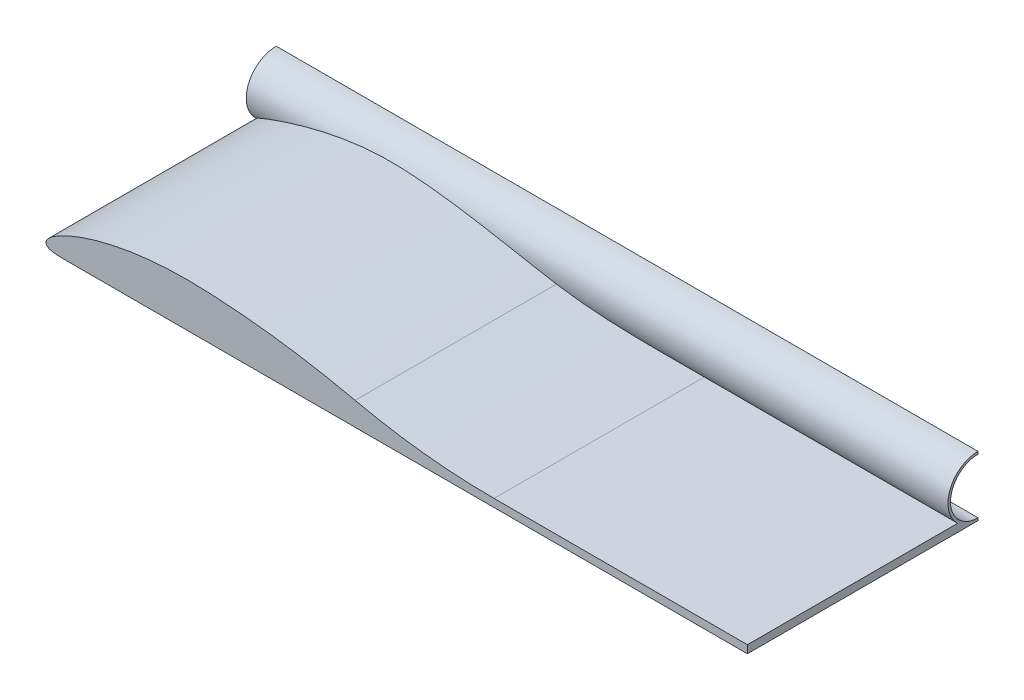
ISO-10303-21;
HEADER;
FILE_DESCRIPTION(('STEP AP214'),'2;1');
FILE_NAME('part.step','',(''),(''),'','','');
FILE_SCHEMA(('AUTOMOTIVE_DESIGN { 1 0 10303 214 1 1 1 1 }'));
ENDSEC;
DATA;
#1=APPLICATION_CONTEXT('core data for automotive mechanical design processes');
#2=APPLICATION_PROTOCOL_DEFINITION('international standard','automotive_design',2000,#1);
#3=PRODUCT_CONTEXT('',#1,'mechanical');
#4=PRODUCT('Part','Part','',(#3));
#5=PRODUCT_RELATED_PRODUCT_CATEGORY('part','',(#4));
#6=PRODUCT_DEFINITION_FORMATION('','',#4);
#7=PRODUCT_DEFINITION_CONTEXT('part definition',#1,'design');
#8=PRODUCT_DEFINITION('design','',#6,#7);
#9=PRODUCT_DEFINITION_SHAPE('','',#8);
#10=(LENGTH_UNIT() NAMED_UNIT(*) SI_UNIT(.MILLI.,.METRE.));
#11=(NAMED_UNIT(*) PLANE_ANGLE_UNIT() SI_UNIT($,.RADIAN.));
#12=(NAMED_UNIT(*) SI_UNIT($,.STERADIAN.) SOLID_ANGLE_UNIT());
#13=UNCERTAINTY_MEASURE_WITH_UNIT(LENGTH_MEASURE(1.E-05),#10,'distance_accuracy_value','');
#14=(GEOMETRIC_REPRESENTATION_CONTEXT(3) GLOBAL_UNCERTAINTY_ASSIGNED_CONTEXT((#13)) GLOBAL_UNIT_ASSIGNED_CONTEXT((#10,
#11,#12)) REPRESENTATION_CONTEXT('',''));
#15=CARTESIAN_POINT('',(0.,0.,0.));
#16=DIRECTION('',(0.,0.,1.));
#17=DIRECTION('',(1.,0.,0.));
#18=AXIS2_PLACEMENT_3D('',#15,#16,#17);
#19=CARTESIAN_POINT('',(0.,0.,0.));
#20=DIRECTION('',(0.,0.,1.));
#21=DIRECTION('',(1.,0.,0.));
#22=AXIS2_PLACEMENT_3D('',#19,#20,#21);
#23=PLANE('',#22);
#24=DIRECTION('',(0.,1.,0.));
#25=VECTOR('',#24,1.);
#26=CARTESIAN_POINT('',(563.88,0.,0.));
#27=LINE('',#26,#25);
#28=CARTESIAN_POINT('',(563.88,42.5733533691907,0.));
#29=VERTEX_POINT('',#28);
#30=CARTESIAN_POINT('',(563.88,44.6053533691907,0.));
#31=VERTEX_POINT('',#30);
#32=EDGE_CURVE('E109',#29,#31,#27,.T.);
#33=ORIENTED_EDGE('',*,*,#32,.F.);
#34=DIRECTION('',(-1.,0.,0.));
#35=VECTOR('',#34,1.);
#36=CARTESIAN_POINT('',(563.88,42.5733533691907,0.));
#37=LINE('',#36,#35);
#38=CARTESIAN_POINT('',(-0.366692026212437,42.5733533691907,0.));
#39=VERTEX_POINT('',#38);
#40=EDGE_CURVE('E97',#29,#39,#37,.T.);
#41=ORIENTED_EDGE('',*,*,#40,.T.);
#42=DIRECTION('',(0.,1.,0.));
#43=VECTOR('',#42,1.);
#44=CARTESIAN_POINT('',(-0.366692026212367,-3.65464663080933,0.));
#45=LINE('',#44,#43);
#46=CARTESIAN_POINT('',(-0.366692026212367,44.6053533691907,0.));
#47=VERTEX_POINT('',#46);
#48=EDGE_CURVE('E214',#39,#47,#45,.T.);
#49=ORIENTED_EDGE('',*,*,#48,.T.);
#50=DIRECTION('',(-1.,0.,0.));
#51=VECTOR('',#50,1.);
#52=CARTESIAN_POINT('',(563.88,44.6053533691907,0.));
#53=LINE('',#52,#51);
#54=EDGE_CURVE('E116',#31,#47,#53,.T.);
#55=ORIENTED_EDGE('',*,*,#54,.F.);
#56=EDGE_LOOP('',(#33,#41,#49,#55));
#57=FACE_BOUND('',#56,.T.);
#58=ADVANCED_FACE('F35',(#57),#23,.F.);
#59=CARTESIAN_POINT('',(0.,2.69535336919036,185.42));
#60=DIRECTION('',(0.,-1.,0.));
#61=DIRECTION('',(1.,0.,0.));
#62=AXIS2_PLACEMENT_3D('',#59,#60,#61);
#63=PLANE('',#62);
#64=DIRECTION('',(-1.,0.,0.));
#65=VECTOR('',#64,1.);
#66=CARTESIAN_POINT('',(563.88,2.69535336919068,16.3134453749047));
#67=LINE('',#66,#65);
#68=CARTESIAN_POINT('',(360.180421151929,2.69535336919025,16.3134453749043));
#69=VERTEX_POINT('',#68);
#70=CARTESIAN_POINT('',(563.88,2.69535336919067,16.3134453749047));
#71=VERTEX_POINT('',#70);
#72=EDGE_CURVE('E121',#69,#71,#67,.F.);
#73=ORIENTED_EDGE('',*,*,#72,.F.);
#74=DIRECTION('',(0.,0.,1.));
#75=VECTOR('',#74,1.);
#76=CARTESIAN_POINT('',(360.180421151928,2.69535336919056,185.42));
#77=LINE('',#76,#75);
#78=CARTESIAN_POINT('',(360.180421151928,2.69535336919056,185.42));
#79=VERTEX_POINT('',#78);
#80=EDGE_CURVE('E137',#69,#79,#77,.T.);
#81=ORIENTED_EDGE('',*,*,#80,.T.);
#82=DIRECTION('',(-1.,0.,0.));
#83=VECTOR('',#82,1.);
#84=CARTESIAN_POINT('',(0.,2.69535336919036,185.42));
#85=LINE('',#84,#83);
#86=CARTESIAN_POINT('',(563.88,2.69535336919067,185.42));
#87=VERTEX_POINT('',#86);
#88=EDGE_CURVE('E120',#87,#79,#85,.T.);
#89=ORIENTED_EDGE('',*,*,#88,.F.);
#90=DIRECTION('',(0.,0.,-1.));
#91=VECTOR('',#90,1.);
#92=CARTESIAN_POINT('',(563.88,2.69535336919067,185.42));
#93=LINE('',#92,#91);
#94=EDGE_CURVE('E125',#87,#71,#93,.T.);
#95=ORIENTED_EDGE('',*,*,#94,.T.);
#96=EDGE_LOOP('',(#73,#81,#89,#95));
#97=FACE_BOUND('',#96,.T.);
#98=ADVANCED_FACE('F174',(#97),#63,.F.);
#99=CARTESIAN_POINT('',(304.8,0.,185.42));
#100=CARTESIAN_POINT('',(304.806765113415,0.0297936907438,185.42));
#101=CARTESIAN_POINT('',(303.042265442166,0.505757681104882,185.42));
#102=CARTESIAN_POINT('',(301.260699107524,1.13128828679422,185.42));
#103=CARTESIAN_POINT('',(296.859481645383,2.43138214292342,185.42));
#104=CARTESIAN_POINT('',(291.428347563501,4.05950750692163,185.42));
#105=CARTESIAN_POINT('',(284.271481229636,6.10623828707882,185.42));
#106=CARTESIAN_POINT('',(275.759062516084,8.44101190552645,185.42));
#107=CARTESIAN_POINT('',(265.867595029522,11.0139121726236,185.42));
#108=CARTESIAN_POINT('',(254.72828410266,13.7239516275996,185.42));
#109=CARTESIAN_POINT('',(242.45219776627,16.501342019607,185.42));
#110=CARTESIAN_POINT('',(229.161916522714,19.2494538440017,185.42));
#111=CARTESIAN_POINT('',(215.002240334106,21.8918598082205,185.42));
#112=CARTESIAN_POINT('',(200.122077246214,24.3476644337164,185.42));
#113=CARTESIAN_POINT('',(184.681833301631,26.5449418917091,185.42));
#114=CARTESIAN_POINT('',(168.851714947921,28.4233907056108,185.42));
#115=CARTESIAN_POINT('',(152.808183208541,29.930661937332,185.42));
#116=CARTESIAN_POINT('',(136.726583628561,31.0048710051825,185.42));
#117=CARTESIAN_POINT('',(120.705050439528,31.6889083800929,185.42));
#118=CARTESIAN_POINT('',(104.91367571592,31.6961733177902,185.42));
#119=CARTESIAN_POINT('',(89.5648924045714,30.8862286831657,185.42));
#120=CARTESIAN_POINT('',(74.9378034426248,29.3709102924395,185.42));
#121=CARTESIAN_POINT('',(61.2207309550213,27.2233169079844,185.42));
#122=CARTESIAN_POINT('',(48.5867513337238,24.5540455106148,185.42));
#123=CARTESIAN_POINT('',(37.1861333906392,21.5011014723962,185.42));
#124=CARTESIAN_POINT('',(27.1552746614983,18.1970778873359,185.42));
#125=CARTESIAN_POINT('',(18.5969283006425,14.8044671458805,185.42));
#126=CARTESIAN_POINT('',(11.6063717286755,11.4360388322654,185.42));
#127=CARTESIAN_POINT('',(6.20537461581932,8.26316028915888,185.42));
#128=CARTESIAN_POINT('',(2.4620711553724,5.3102193566351,185.42));
#129=CARTESIAN_POINT('',(0.172825892274397,2.71807809904705,185.42));
#130=CARTESIAN_POINT('',(-0.366692026212387,-0.106725709936372,185.42));
#131=CARTESIAN_POINT('',(1.61853864418734,-2.17519153343636,185.42));
#132=CARTESIAN_POINT('',(4.90312913802598,-3.1117877974165,185.42));
#133=CARTESIAN_POINT('',(9.54050066961738,-3.65904451106276,185.42));
#134=CARTESIAN_POINT('',(15.6223250235567,-3.68468011379504,185.42));
#135=CARTESIAN_POINT('',(23.0877165309997,-3.30949507157914,185.42));
#136=CARTESIAN_POINT('',(31.8617424793389,-2.56072504363965,185.42));
#137=CARTESIAN_POINT('',(41.8437098749915,-1.53618962834286,185.42));
#138=CARTESIAN_POINT('',(52.9319861205823,-0.324549042889645,185.42));
#139=CARTESIAN_POINT('',(65.0085126482625,0.982737612858198,185.42));
#140=CARTESIAN_POINT('',(77.9641225568185,2.27751163277432,185.42));
#141=CARTESIAN_POINT('',(91.6740314858693,3.44660128053989,185.42));
#142=CARTESIAN_POINT('',(106.020407657375,4.41212483885966,185.42));
#143=CARTESIAN_POINT('',(120.95534562256,5.05177624345621,185.42));
#144=CARTESIAN_POINT('',(136.33914130998,5.41029723383236,185.42));
#145=CARTESIAN_POINT('',(152.007716340095,5.72933017095042,185.42));
#146=CARTESIAN_POINT('',(167.715786189237,5.89135553497832,185.42));
#147=CARTESIAN_POINT('',(183.286749282816,5.90781947795733,185.42));
#148=CARTESIAN_POINT('',(198.553027184666,5.75950083301546,185.42));
#149=CARTESIAN_POINT('',(213.347799024157,5.45737661505621,185.42));
#150=CARTESIAN_POINT('',(227.508384673819,5.01338248731081,185.42));
#151=CARTESIAN_POINT('',(240.877077650288,4.45854649480439,185.42));
#152=CARTESIAN_POINT('',(253.302348041566,3.81956254234677,185.42));
#153=CARTESIAN_POINT('',(264.636493620716,3.14064435260617,185.42));
#154=CARTESIAN_POINT('',(274.759317931257,2.45167335072776,185.42));
#155=CARTESIAN_POINT('',(283.511762664263,1.80333800911344,185.42));
#156=CARTESIAN_POINT('',(290.902443864489,1.20739442477992,185.42));
#157=CARTESIAN_POINT('',(296.536660630331,0.742433739926797,185.42));
#158=CARTESIAN_POINT('',(301.097723541562,0.310240549260641,185.42));
#159=CARTESIAN_POINT('',(302.984341567181,0.206591885939164,185.42));
#160=CARTESIAN_POINT('',(304.793276654245,-0.0296097451566188,185.42));
#161=CARTESIAN_POINT('',(304.8,0.,185.42));
#162=B_SPLINE_CURVE_WITH_KNOTS('',3,(#99,#100,#101,#102,#103,#104,#105,#106,#107,#108,#109,#110,
#111,#112,#113,#114,#115,#116,#117,#118,#119,#120,#121,#122,#123,#124,#125,#126,#127,#128,#129,
#130,#131,#132,#133,#134,#135,#136,#137,#138,#139,#140,#141,#142,#143,#144,#145,#146,#147,#148,
#149,#150,#151,#152,#153,#154,#155,#156,#157,#158,#159,#160,#161),.UNSPECIFIED.,.T.,.F.,(4,1,1,
1,1,1,1,1,1,1,1,1,1,1,1,1,1,1,1,1,1,1,1,1,1,1,1,1,1,1,1,1,1,1,1,1,1,1,1,1,1,1,1,1,1,1,1,1,1,1,1,
1,1,1,1,1,1,1,1,1,4),(0.,0.00137455348322331,0.00548449728179396,0.0122733609908927,
0.021682195504866,0.0335806119079948,0.0478307427867091,0.0643059527211734,0.082777332043007,
0.103063756455997,0.124929016786915,0.148149110667858,0.172444694611559,0.197572105868171,
0.223268880537162,0.249227774933554,0.275186209349679,0.300900708934774,0.326462938278696,
0.351222485186767,0.374905858971967,0.397269706218861,0.418072413969665,0.437079533175026,
0.454093093767394,0.468919631578705,0.48139171235289,0.491447126518173,0.499023571234557,
0.504293734329401,0.507921918342,0.511539686153778,0.516780527527172,0.524216490268905,
0.533991629403711,0.546033957270731,0.560220284382465,0.576403357410148,0.594370816485922,
0.613951103581465,0.634916884969972,0.657088503485648,0.680229909573905,0.704175481107386,
0.72909036740664,0.754353775526935,0.779667752347888,0.804760119952374,0.829359338708984,
0.853208710008459,0.876041363199166,0.897604065496152,0.917662212410958,0.935969860405553,
0.952309787739252,0.966502759006892,0.978350082728452,0.987731492337842,0.994510920242662,
0.998633932979557,1.),.UNSPECIFIED.);
#163=DIRECTION('',(0.,0.,-1.));
#164=VECTOR('',#163,1.);
#165=SURFACE_OF_LINEAR_EXTRUSION('',#162,#164);
#166=CARTESIAN_POINT('',(248.468052168918,15.1306788652424,23.5306471319181));
#167=CARTESIAN_POINT('',(247.164925425588,15.4244599020673,23.5973598162857));
#168=CARTESIAN_POINT('',(245.860667643667,15.7146705661414,23.6575076004121));
#169=CARTESIAN_POINT('',(243.250371487808,16.2877798033205,23.7656545449886));
#170=CARTESIAN_POINT('',(241.944333617626,16.570680118452,23.8136566241335));
#171=CARTESIAN_POINT('',(239.330538940863,17.1290944674202,23.8985177440096));
#172=CARTESIAN_POINT('',(238.022782439655,17.4046096652577,23.9353785502894));
#173=CARTESIAN_POINT('',(235.405630746313,17.948315130686,23.9988726415726));
#174=CARTESIAN_POINT('',(234.096235720714,18.2165060880256,24.0255068927519));
#175=CARTESIAN_POINT('',(231.475881403626,18.7455977285112,24.0693852137111));
#176=CARTESIAN_POINT('',(230.164922187072,19.0064987473441,24.0866297165482));
#177=CARTESIAN_POINT('',(227.541510589522,19.5210404418597,24.1124974438974));
#178=CARTESIAN_POINT('',(226.229058224272,19.7746811933824,24.1211207584976));
#179=CARTESIAN_POINT('',(223.590572588544,20.2769467022491,24.1305036972607));
#180=CARTESIAN_POINT('',(222.264526087185,20.5255032726702,24.131189772704));
#181=CARTESIAN_POINT('',(219.611009151825,21.0150974013907,24.1252048827666));
#182=CARTESIAN_POINT('',(218.283538663402,21.2561346608944,24.1185336254086));
#183=CARTESIAN_POINT('',(215.627225028148,21.7306291851339,24.0984973019987));
#184=CARTESIAN_POINT('',(214.298381814655,21.9640860619945,24.0851318939916));
#185=CARTESIAN_POINT('',(211.639376243386,22.4233652891199,24.0523419332322));
#186=CARTESIAN_POINT('',(210.3092138161,22.6491872123968,24.0329170422202));
#187=CARTESIAN_POINT('',(207.647621966798,23.0931465145668,23.9886188641133));
#188=CARTESIAN_POINT('',(206.316192479227,23.3112834708545,23.9637452779295));
#189=CARTESIAN_POINT('',(203.652127765779,23.7398215926449,23.9091357746223));
#190=CARTESIAN_POINT('',(202.319492483819,23.9502223771345,23.879399618405));
#191=CARTESIAN_POINT('',(196.819782154878,24.8020958855171,23.747905116942));
#192=CARTESIAN_POINT('',(192.647776198739,25.4094117409486,23.627387947626));
#193=CARTESIAN_POINT('',(186.382451644461,26.2623772054259,23.4275976268318));
#194=CARTESIAN_POINT('',(184.292700181344,26.5370416142409,23.3578283248664));
#195=CARTESIAN_POINT('',(180.110865849613,27.0668362085989,23.2138890742936));
#196=CARTESIAN_POINT('',(178.018782986636,27.3219664412765,23.1397191363056));
#197=CARTESIAN_POINT('',(173.832091101023,27.8124298675254,22.9889113459885));
#198=CARTESIAN_POINT('',(171.737481763998,28.0477602667634,22.9122731474194));
#199=CARTESIAN_POINT('',(167.546120948386,28.4983443350211,22.758408536589));
#200=CARTESIAN_POINT('',(165.449369465407,28.7135979627948,22.6811821231197));
#201=CARTESIAN_POINT('',(161.253324170779,29.1233268268424,22.5281447899772));
#202=CARTESIAN_POINT('',(159.154029910838,29.3177976034178,22.4523341769829));
#203=CARTESIAN_POINT('',(156.003591619495,29.5932868090232,22.3412172571027));
#204=CARTESIAN_POINT('',(154.953197336471,29.6824136176628,22.3046114939976));
#205=CARTESIAN_POINT('',(152.851914836116,29.855142762026,22.2325260478665));
#206=CARTESIAN_POINT('',(151.801026618778,29.9387450976682,22.1970463648571));
#207=CARTESIAN_POINT('',(149.698429626551,30.1004946870228,22.1273882749824));
#208=CARTESIAN_POINT('',(148.646720694326,30.1786400851258,22.0932103125405));
#209=CARTESIAN_POINT('',(146.542872545462,30.3295725009166,22.0263042476333));
#210=CARTESIAN_POINT('',(145.490733328901,30.4023595195741,21.9935761449056));
#211=CARTESIAN_POINT('',(143.386044476677,30.5426838406565,21.9296990409475));
#212=CARTESIAN_POINT('',(142.333494836223,30.6102210798149,21.8985500587492));
#213=CARTESIAN_POINT('',(140.22802833324,30.7401568252864,21.8379451862777));
#214=CARTESIAN_POINT('',(139.175111470363,30.8025553267085,21.8084892976159));
#215=CARTESIAN_POINT('',(137.595205046186,30.8924021929062,21.7656402106702));
#216=CARTESIAN_POINT('',(137.068340026543,30.9217333453354,21.7515760555141));
#217=CARTESIAN_POINT('',(136.014529847765,30.9791467370254,21.723909414589));
#218=CARTESIAN_POINT('',(135.487584688631,31.0072289762968,21.710306928816));
#219=CARTESIAN_POINT('',(133.90662409391,31.0894528307716,21.6702908584459));
#220=CARTESIAN_POINT('',(132.852482133557,31.1415716630644,21.6446686223431));
#221=CARTESIAN_POINT('',(130.743855405444,31.2396580700173,21.5960562117018));
#222=CARTESIAN_POINT('',(129.68937063952,31.2856256771112,21.5730660232854));
#223=CARTESIAN_POINT('',(127.580056421672,31.3706445245526,21.5302530454921));
#224=CARTESIAN_POINT('',(126.525226969814,31.4096957662247,21.5104302555087));
#225=CARTESIAN_POINT('',(124.418696900435,31.4800110535866,21.4745424137873));
#226=CARTESIAN_POINT('',(123.366997339438,31.5113001630598,21.4584652779117));
#227=CARTESIAN_POINT('',(121.263330618903,31.5654721705467,21.4305172383515));
#228=CARTESIAN_POINT('',(120.211363459517,31.5883550733669,21.4186463322618));
#229=CARTESIAN_POINT('',(117.055150767096,31.643461313098,21.3900023663553));
#230=CARTESIAN_POINT('',(114.950564613289,31.6621431998202,21.3801975320988));
#231=CARTESIAN_POINT('',(111.793998324506,31.6601651237236,21.381224966841));
#232=CARTESIAN_POINT('',(110.741981340088,31.6545079624803,21.3841886614369));
#233=CARTESIAN_POINT('',(108.638080668525,31.6327097899938,21.3955714562194));
#234=CARTESIAN_POINT('',(107.586196981156,31.616568796569,21.4039905471341));
#235=CARTESIAN_POINT('',(105.482715806836,31.5732638595657,21.4264761607399));
#236=CARTESIAN_POINT('',(104.431118319515,31.5460999302513,21.4405426761232));
#237=CARTESIAN_POINT('',(102.328371993492,31.4804845389142,21.4742941808888));
#238=CARTESIAN_POINT('',(101.277223155197,31.4420330666282,21.4939791753798));
#239=CARTESIAN_POINT('',(98.1263949923219,31.3099614304446,21.5610339582473));
#240=CARTESIAN_POINT('',(96.0275485587578,31.1995872698833,21.6164233218179));
#241=CARTESIAN_POINT('',(92.8818774999132,31.0007119330984,21.7135679148997));
#242=CARTESIAN_POINT('',(91.8337372584263,30.9288664250577,21.7482935215372));
#243=CARTESIAN_POINT('',(89.7384142221836,30.7741360954731,21.821992451529));
#244=CARTESIAN_POINT('',(88.6912314276031,30.6912512719082,21.8609657756609));
#245=CARTESIAN_POINT('',(86.598986939082,30.514446862541,21.9427204111561));
#246=CARTESIAN_POINT('',(85.5539241718931,30.4205382201093,21.9854979360202));
#247=CARTESIAN_POINT('',(83.4650273575664,30.2214188035248,22.074486882469));
#248=CARTESIAN_POINT('',(82.4211933098077,30.1162080350869,22.1206983023172));
#249=CARTESIAN_POINT('',(79.2917567496272,29.7833568846619,22.263794315259));
#250=CARTESIAN_POINT('',(77.208159777612,29.5384926062069,22.3651430584868));
#251=CARTESIAN_POINT('',(73.050024291015,29.0017171934316,22.5752283496702));
#252=CARTESIAN_POINT('',(70.9754778067887,28.7098640557295,22.6839556959961));
#253=CARTESIAN_POINT('',(66.83391160139,28.0772498234021,22.9037159803775));
#254=CARTESIAN_POINT('',(64.7668920427172,27.7364876792184,23.0147489678668));
#255=CARTESIAN_POINT('',(60.6441150825566,27.0049032926643,23.2328956045681));
#256=CARTESIAN_POINT('',(58.5883470452797,26.6141424061632,23.3400138540043));
#257=CARTESIAN_POINT('',(54.4869897840124,25.7802239542595,23.5435680743987));
#258=CARTESIAN_POINT('',(52.4413999364016,25.3370696412597,23.6400047077157));
#259=CARTESIAN_POINT('',(49.6366710572678,24.6901833252625,23.7597178016525));
#260=CARTESIAN_POINT('',(48.8724223130925,24.509885744065,23.7910539004651));
#261=CARTESIAN_POINT('',(47.3456910665187,24.1415006362864,23.8505994404017));
#262=CARTESIAN_POINT('',(46.5832085418874,23.9534132083307,23.8788089210944));
#263=CARTESIAN_POINT('',(44.2984421761506,23.377047185208,23.9580402330502));
#264=CARTESIAN_POINT('',(42.7789893010381,22.9766992947982,24.003658356908));
#265=CARTESIAN_POINT('',(39.7482676373902,22.1417221169858,24.0760437481644));
#266=CARTESIAN_POINT('',(38.2370029789606,21.7070769895677,24.1028022480011));
#267=CARTESIAN_POINT('',(35.9772640369443,21.0279285009986,24.1247343794962));
#268=CARTESIAN_POINT('',(35.2248122333731,20.796885345117,24.1290082402952));
#269=CARTESIAN_POINT('',(33.7228207663263,20.3254726463559,24.1306864939977));
#270=CARTESIAN_POINT('',(32.9732810961061,20.0851031250911,24.1280909028206));
#271=CARTESIAN_POINT('',(31.4835646463585,19.5967476032068,24.1152258221477));
#272=CARTESIAN_POINT('',(30.7433615223194,19.3488403466655,24.1050195175785));
#273=CARTESIAN_POINT('',(29.2664467355791,18.8432673729213,24.0760735735258));
#274=CARTESIAN_POINT('',(28.529735093407,18.5856015984207,24.0573338839307));
#275=CARTESIAN_POINT('',(27.4276342175429,18.1916161499448,24.0220484798311));
#276=CARTESIAN_POINT('',(27.0607836159445,18.0590480493596,24.0090916929807));
#277=CARTESIAN_POINT('',(26.3281068625655,17.7913780467449,23.9806440571999));
#278=CARTESIAN_POINT('',(25.9622807107914,17.6562761446993,23.9651532082537));
#279=CARTESIAN_POINT('',(24.8664780781173,17.2469943856455,23.9146449687277));
#280=CARTESIAN_POINT('',(24.1381617863175,16.9688328976297,23.8755913981653));
#281=CARTESIAN_POINT('',(22.6877214643666,16.4013971725756,23.7853357188219));
#282=CARTESIAN_POINT('',(21.9655905984079,16.1121378982814,23.7341495168269));
#283=CARTESIAN_POINT('',(20.5274332217103,15.5213427176289,23.6179032093737));
#284=CARTESIAN_POINT('',(19.8114069032272,15.2198064263345,23.552842668625));
#285=CARTESIAN_POINT('',(18.7431928434948,14.7579680611181,23.4434075982554));
#286=CARTESIAN_POINT('',(18.3882864530084,14.6025212723569,23.4049796415464));
#287=CARTESIAN_POINT('',(17.6804290392914,14.2883174281435,23.3238891967892));
#288=CARTESIAN_POINT('',(17.3274780173177,14.1295603705639,23.2812267060195));
#289=CARTESIAN_POINT('',(16.2719192431102,13.6481369684733,23.1464301889592));
#290=CARTESIAN_POINT('',(15.5725154386957,13.3202794408136,23.0474780259347));
#291=CARTESIAN_POINT('',(14.2952000113767,12.7034780334779,22.8460617405299));
#292=CARTESIAN_POINT('',(13.7157562175521,12.4167023101754,22.7466933398176));
#293=CARTESIAN_POINT('',(12.8530205805945,11.9784766015845,22.5850437661351));
#294=CARTESIAN_POINT('',(12.5664960585783,11.8310482411346,22.5290571986059));
#295=CARTESIAN_POINT('',(11.9957725544069,11.5334698186662,22.4126113035908));
#296=CARTESIAN_POINT('',(11.7115735923137,11.3833197332038,22.3521519375641));
#297=CARTESIAN_POINT('',(11.1447971141671,11.0798640840244,22.2263080700688));
#298=CARTESIAN_POINT('',(10.8622272054942,10.9265502807249,22.1609090846444));
#299=CARTESIAN_POINT('',(10.3000141938409,10.6169080242378,22.0249066059508));
#300=CARTESIAN_POINT('',(10.0203711031546,10.4605795583949,21.9543030908299));
#301=CARTESIAN_POINT('',(9.18660213336555,9.98646021613357,21.7338867067473));
#302=CARTESIAN_POINT('',(8.63758860489206,9.66350993895925,21.5754575609465));
#303=CARTESIAN_POINT('',(7.73352324581887,9.10933139853174,21.2869358953538));
#304=CARTESIAN_POINT('',(7.3734245771217,8.8824059452859,21.1643685820549));
#305=CARTESIAN_POINT('',(6.66328414474176,8.42096677424417,20.904993117441));
#306=CARTESIAN_POINT('',(6.31324288623625,8.18645267652914,20.768184252372));
#307=CARTESIAN_POINT('',(5.62488156916675,7.70983314736322,20.4786773577273));
#308=CARTESIAN_POINT('',(5.28656482350431,7.46772560651989,20.3259748852377));
#309=CARTESIAN_POINT('',(4.62585239453915,6.97650014599702,20.0030973472415));
#310=CARTESIAN_POINT('',(4.30340129479291,6.72741223042838,19.832990605972));
#311=CARTESIAN_POINT('',(3.67619732898747,6.22163150290306,19.4726638090509));
#312=CARTESIAN_POINT('',(3.37143967063751,5.96494077889064,19.2824492393745));
#313=CARTESIAN_POINT('',(2.92990669768291,5.57519748740403,18.9807590960356));
#314=CARTESIAN_POINT('',(2.78535982966867,5.44452790251347,18.8774922809253));
#315=CARTESIAN_POINT('',(2.50178563290781,5.18181803195167,18.6652932022627));
#316=CARTESIAN_POINT('',(2.36275784638986,5.04977786111232,18.5563614103215));
#317=CARTESIAN_POINT('',(2.1196758778739,4.8131027180856,18.3567261023933));
#318=CARTESIAN_POINT('',(2.01451911366003,4.70866755741676,18.2671275491314));
#319=CARTESIAN_POINT('',(1.80896096359355,4.49878319144228,18.0838462919607));
#320=CARTESIAN_POINT('',(1.70855777117417,4.39333438999487,17.9901651660309));
#321=CARTESIAN_POINT('',(1.51371893208835,4.18113236783861,17.7981944600157));
#322=CARTESIAN_POINT('',(1.41928257489575,4.0743793042538,17.6999054310732));
#323=CARTESIAN_POINT('',(1.23766327887646,3.85973765483568,17.4985661189975));
#324=CARTESIAN_POINT('',(1.15046609175272,3.75185179418784,17.3955258409433));
#325=CARTESIAN_POINT('',(0.984054683661011,3.53489040416991,17.1843106457498));
#326=CARTESIAN_POINT('',(0.904841741324642,3.42581468734091,17.0761349102635));
#327=CARTESIAN_POINT('',(0.755142291488923,3.20687076402986,16.8546920019468));
#328=CARTESIAN_POINT('',(0.684654615273389,3.09700266577516,16.7414255137798));
#329=CARTESIAN_POINT('',(0.552197490885366,2.87593917913959,16.5088912545192));
#330=CARTESIAN_POINT('',(0.490313668544194,2.76474097213364,16.3895773452931));
#331=CARTESIAN_POINT('',(0.375956617064514,2.54261571219954,16.1462367205038));
#332=CARTESIAN_POINT('',(0.32348528244029,2.4316887182821,16.0222090622472));
#333=CARTESIAN_POINT('',(0.227715064795377,2.21073874526217,15.7698725950014));
#334=CARTESIAN_POINT('',(0.184416873623161,2.10071583494775,15.641563463943));
#335=CARTESIAN_POINT('',(0.106822728177668,1.88201873385453,15.3809547073691));
#336=CARTESIAN_POINT('',(0.072533734716212,1.77334564739453,15.2486520838179));
#337=CARTESIAN_POINT('',(0.0131321781269733,1.55788369250428,14.9805146308854));
#338=CARTESIAN_POINT('',(-0.0119811059083533,1.451094676676,14.8446800798955));
#339=CARTESIAN_POINT('',(-0.0527980234659968,1.23977438084073,14.569813297269));
#340=CARTESIAN_POINT('',(-0.0684992042458906,1.13524369617751,14.4307802419127));
#341=CARTESIAN_POINT('',(-0.0897230222665704,0.932627377028764,14.1551031808664));
#342=CARTESIAN_POINT('',(-0.095595948381614,0.834445718639106,14.0185569354299));
#343=CARTESIAN_POINT('',(-0.0978413079864649,0.640944601006236,13.74341334122));
#344=CARTESIAN_POINT('',(-0.0942158668285974,0.545624506287711,13.6048164581972));
#345=CARTESIAN_POINT('',(-0.0769527238796686,0.358228912099907,13.3261534313959));
#346=CARTESIAN_POINT('',(-0.063321167626482,0.266151457432593,13.1860882414445));
#347=CARTESIAN_POINT('',(-0.034915482486713,0.13068919380417,12.9753047617264));
#348=CARTESIAN_POINT('',(-0.0241139034212195,0.0859579799193855,12.9048976203145));
#349=CARTESIAN_POINT('',(0.000261522493651618,-0.00256073836757956,12.7639670700142));
#350=CARTESIAN_POINT('',(0.0138353384418665,-0.0463482532828313,12.6934436624305));
#351=CARTESIAN_POINT('',(0.0436657911449987,-0.132959559286388,12.5523382236647));
#352=CARTESIAN_POINT('',(0.0599234060223066,-0.175782992520708,12.4817561804787));
#353=CARTESIAN_POINT('',(0.0949324637457314,-0.260433987080513,12.3406156876959));
#354=CARTESIAN_POINT('',(0.113683960445668,-0.302261526877298,12.2700572386415));
#355=CARTESIAN_POINT('',(0.173451504149284,-0.426251059819882,12.0584641709395));
#356=CARTESIAN_POINT('',(0.217977207335229,-0.506910308724331,11.9175275803395));
#357=CARTESIAN_POINT('',(0.314176364398655,-0.662559729249102,11.6391767541583));
#358=CARTESIAN_POINT('',(0.365682168851773,-0.737632847285576,11.5017501537905));
#359=CARTESIAN_POINT('',(0.475570224967572,-0.883989532532344,11.2276227687443));
#360=CARTESIAN_POINT('',(0.533953092196701,-0.955272759679101,11.0909220501859));
#361=CARTESIAN_POINT('',(0.656817903047132,-1.09416180590653,10.8183327943662));
#362=CARTESIAN_POINT('',(0.721302157183655,-1.16176621647968,10.6824445856696));
#363=CARTESIAN_POINT('',(0.855728015736456,-1.29338548867756,10.4116079595335));
#364=CARTESIAN_POINT('',(0.92567049209924,-1.35739977396397,10.2766596960155));
#365=CARTESIAN_POINT('',(1.07060106078432,-1.48197901940051,10.0077187548296));
#366=CARTESIAN_POINT('',(1.14559336869578,-1.54254101773041,9.87372698146489));
#367=CARTESIAN_POINT('',(1.30024626420514,-1.66021881131996,9.6070068364324));
#368=CARTESIAN_POINT('',(1.37990512720297,-1.71733586407271,9.47427801883738));
#369=CARTESIAN_POINT('',(1.54387226368337,-1.82817710352826,9.21031541744942));
#370=CARTESIAN_POINT('',(1.62817976376739,-1.88190185144093,9.07908138932412));
#371=CARTESIAN_POINT('',(1.80170690075908,-1.98596184408878,8.81849789562511));
#372=CARTESIAN_POINT('',(1.89092714983777,-2.0362966646645,8.68914866746497));
#373=CARTESIAN_POINT('',(2.06369671097381,-2.12787601641531,8.44781466543258));
#374=CARTESIAN_POINT('',(2.14668599156749,-2.16949468934537,8.33557077572284));
#375=CARTESIAN_POINT('',(2.31671947240929,-2.25010351113309,8.11322947702756));
#376=CARTESIAN_POINT('',(2.40376362293026,-2.28909369221108,8.00313204174232));
#377=CARTESIAN_POINT('',(2.58191788198569,-2.36446569899194,7.78542428183062));
#378=CARTESIAN_POINT('',(2.67302663534242,-2.40084838366902,7.67781314614475));
#379=CARTESIAN_POINT('',(2.85924256138309,-2.47105663229685,7.46536525247963));
#380=CARTESIAN_POINT('',(2.95434739940005,-2.50488365790557,7.36052693128983));
#381=CARTESIAN_POINT('',(3.14841593007707,-2.57008370862691,7.15377371281726));
#382=CARTESIAN_POINT('',(3.24737824206104,-2.60145759990218,7.05185779180409));
#383=CARTESIAN_POINT('',(3.44890942696263,-2.66190701575913,6.85091922880817));
#384=CARTESIAN_POINT('',(3.55147897221042,-2.69098210856643,6.75189713255257));
#385=CARTESIAN_POINT('',(3.75978045602007,-2.7470336146085,6.55652232266901));
#386=CARTESIAN_POINT('',(3.86551396434883,-2.77400896134927,6.46017098135104));
#387=CARTESIAN_POINT('',(4.02594430242592,-2.81308066851999,6.31729173143404));
#388=CARTESIAN_POINT('',(4.07973648570696,-2.8258749833616,6.26993110264661));
#389=CARTESIAN_POINT('',(4.18781676980047,-2.85103662298649,6.1756627963314));
#390=CARTESIAN_POINT('',(4.24210487649466,-2.86340394269719,6.12875512418935));
#391=CARTESIAN_POINT('',(4.34813062548112,-2.88709663776792,6.0377908793497));
#392=CARTESIAN_POINT('',(4.39984855518106,-2.89844229132368,5.99371655145458));
#393=CARTESIAN_POINT('',(4.50349904989243,-2.92082513235832,5.90574212881744));
#394=CARTESIAN_POINT('',(4.55543161588754,-2.93186231842171,5.86184203487573));
#395=CARTESIAN_POINT('',(4.71153579594822,-2.96452017201387,5.73039111942377));
#396=CARTESIAN_POINT('',(4.81601337717227,-2.98568702033486,5.64309010463194));
#397=CARTESIAN_POINT('',(5.02576424240332,-3.02682511407635,5.46923067488123));
#398=CARTESIAN_POINT('',(5.13103727910891,-3.04679671515301,5.38267204565289));
#399=CARTESIAN_POINT('',(5.34240913069679,-3.08557587082942,5.21030871217269));
#400=CARTESIAN_POINT('',(5.44850793757968,-3.10438343668968,5.12450400063456));
#401=CARTESIAN_POINT('',(5.76803114458377,-3.15909445285144,4.86829294916171));
#402=CARTESIAN_POINT('',(5.98270368910044,-3.19329040072653,4.69907197243126));
#403=CARTESIAN_POINT('',(6.41557709542678,-3.25737038848028,4.36392734063898));
#404=CARTESIAN_POINT('',(6.63378118255392,-3.28725020682964,4.19800704883353));
#405=CARTESIAN_POINT('',(7.07347435571272,-3.34288951879,3.86987060078193));
#406=CARTESIAN_POINT('',(7.29496343715234,-3.36864901816013,3.70765443935862));
#407=CARTESIAN_POINT('',(7.7411089280671,-3.41629665926432,3.38706813709178));
#408=CARTESIAN_POINT('',(7.96576525015243,-3.43818490758824,3.22869789045959));
#409=CARTESIAN_POINT('',(8.32592157521145,-3.47018405384344,2.97941012535629));
#410=CARTESIAN_POINT('',(8.4604828690485,-3.48146184269799,2.88728058854831));
#411=CARTESIAN_POINT('',(8.73053063417342,-3.50281295604267,2.70424380430381));
#412=CARTESIAN_POINT('',(8.86601711305455,-3.51288627063474,2.61333656691729));
#413=CARTESIAN_POINT('',(9.13774693976684,-3.5318940879202,2.43253484717519));
#414=CARTESIAN_POINT('',(9.27399030321118,-3.54082856702971,2.3426403858281));
#415=CARTESIAN_POINT('',(9.54721063829915,-3.55759529282741,2.16387143080082));
#416=CARTESIAN_POINT('',(9.68418760702039,-3.56542754390305,2.07499693306194));
#417=CARTESIAN_POINT('',(10.0960684378415,-3.58731102800854,1.81010031531896));
#418=CARTESIAN_POINT('',(10.37209750591,-3.59976116599191,1.63568832002082));
#419=CARTESIAN_POINT('',(10.9271983955538,-3.62067275482263,1.29156424715572));
#420=CARTESIAN_POINT('',(11.2062700582388,-3.62913441294524,1.12185192578535));
#421=CARTESIAN_POINT('',(11.7546861056318,-3.64206823065376,0.79520682412499));
#422=CARTESIAN_POINT('',(12.0238900957588,-3.64670546362662,0.638044825772742));
#423=CARTESIAN_POINT('',(12.5652288127328,-3.65290235331282,0.32877744983815));
#424=CARTESIAN_POINT('',(12.8373635290318,-3.65446202109894,0.176672054064588));
#425=CARTESIAN_POINT('',(13.1276936917275,-3.65464149077084,0.0182024147398362));
#426=CARTESIAN_POINT('',(13.14440168768,-3.65464663445426,0.00909605422928165));
#427=CARTESIAN_POINT('',(13.1611152527335,-3.6546466308094,0.));
#428=B_SPLINE_CURVE_WITH_KNOTS('',3,(#166,#167,#168,#169,#170,#171,#172,#173,#174,#175,#176,
#177,#178,#179,#180,#181,#182,#183,#184,#185,#186,#187,#188,#189,#190,#191,#192,#193,#194,#195,
#196,#197,#198,#199,#200,#201,#202,#203,#204,#205,#206,#207,#208,#209,#210,#211,#212,#213,#214,
#215,#216,#217,#218,#219,#220,#221,#222,#223,#224,#225,#226,#227,#228,#229,#230,#231,#232,#233,
#234,#235,#236,#237,#238,#239,#240,#241,#242,#243,#244,#245,#246,#247,#248,#249,#250,#251,#252,
#253,#254,#255,#256,#257,#258,#259,#260,#261,#262,#263,#264,#265,#266,#267,#268,#269,#270,#271,
#272,#273,#274,#275,#276,#277,#278,#279,#280,#281,#282,#283,#284,#285,#286,#287,#288,#289,#290,
#291,#292,#293,#294,#295,#296,#297,#298,#299,#300,#301,#302,#303,#304,#305,#306,#307,#308,#309,
#310,#311,#312,#313,#314,#315,#316,#317,#318,#319,#320,#321,#322,#323,#324,#325,#326,#327,#328,
#329,#330,#331,#332,#333,#334,#335,#336,#337,#338,#339,#340,#341,#342,#343,#344,#345,#346,#347,
#348,#349,#350,#351,#352,#353,#354,#355,#356,#357,#358,#359,#360,#361,#362,#363,#364,#365,#366,
#367,#368,#369,#370,#371,#372,#373,#374,#375,#376,#377,#378,#379,#380,#381,#382,#383,#384,#385,
#386,#387,#388,#389,#390,#391,#392,#393,#394,#395,#396,#397,#398,#399,#400,#401,#402,#403,#404,
#405,#406,#407,#408,#409,#410,#411,#412,#413,#414,#415,#416,#417,#418,#419,#420,#421,#422,#423,
#424,#425,#426,#427),.UNSPECIFIED.,.F.,.F.,(4,2,2,2,2,2,2,2,2,2,2,2,2,2,2,2,2,2,2,2,2,2,2,2,2,2,
2,2,2,2,2,2,2,2,2,2,2,2,2,2,2,2,2,2,2,2,2,2,2,2,2,2,2,2,2,2,2,2,2,2,2,2,2,2,2,2,2,2,2,2,2,2,2,2,
2,2,2,2,2,2,2,2,2,2,2,2,2,2,2,2,2,2,2,2,2,2,2,2,2,2,2,2,2,2,2,2,2,2,2,2,2,2,2,2,2,2,2,2,2,2,2,2,
2,2,2,2,2,2,2,2,4),(0.,4.0124543826742,8.02394362775902,12.0347968416616,16.0452710281977,
20.0555602351499,24.065807535707,28.1131854865721,32.1607240642049,36.2084694221288,
40.2564407786784,44.3046343914997,48.3530271150028,61.0050733408162,67.3316445420605,
73.6582004772087,79.9856477812287,86.3131080841963,92.6419234535833,95.8063233252236,
98.9707232434832,102.136194015365,105.301664214367,108.467172555317,111.632683909157,
113.216287135521,114.799890348536,117.967092543812,121.13427803865,124.301462926977,
127.458283877973,130.615103023987,136.928653042259,140.084710295702,143.240762185078,
146.396809990451,149.552860665521,155.859605460863,159.013076186529,162.166547489489,
165.316914393724,168.467279704943,174.767829461798,181.060661472266,187.353628543391,
193.638945973357,199.923873437185,202.281396508483,204.638889740888,209.354337524287,
214.071976006675,216.433309684189,218.794637889449,221.136577366075,223.478530595704,
224.649366694706,225.820202801086,228.161825204323,230.500394383331,232.839036942877,
234.00707104231,235.175105892479,237.510879304445,239.472886954072,240.454013047714,
241.435147596411,242.419279928052,243.40341639188,245.371523595519,246.699981946124,
248.028506908096,249.357404249723,250.681271513558,252.004778517214,252.666239894758,
253.327646293327,253.847112618056,254.366379911377,254.885585253756,255.403743181677,
255.921983958255,256.440155243166,256.963161850722,257.486273609483,258.009424807869,
258.532979029843,259.056492108908,259.580141553366,260.084695768102,260.589137093554,
261.093268861088,261.34556091981,261.597850166473,261.850231564893,262.102618414216,
262.607448367259,263.101793980146,263.596183875622,264.090761745137,264.585418785433,
265.080494010137,265.575387412179,266.070198725281,266.565071836301,267.001973417736,
267.438869642611,267.875621275072,268.312121194932,268.748466291049,269.184893150426,
269.621540250718,269.839946785734,270.058355914457,270.26502832379,270.471701681339,
270.885050457771,271.298275620823,271.711496785843,272.537854942686,273.365015951043,
274.192175803232,275.0193128771,275.509706020026,276.000103192605,276.490510519057,
276.980915893375,277.961093894853,278.941220952346,279.876426517295,280.811628717461,
280.868714131053),.UNSPECIFIED.);
#429=CARTESIAN_POINT('',(13.1611152527334,-3.65464663080933,0.));
#430=VERTEX_POINT('',#429);
#431=CARTESIAN_POINT('',(248.468052126158,15.1306788748815,23.5306471341075));
#432=VERTEX_POINT('',#431);
#433=EDGE_CURVE('E158',#430,#432,#428,.F.);
#434=ORIENTED_EDGE('',*,*,#433,.F.);
#435=DIRECTION('',(0.,0.,-1.));
#436=VECTOR('',#435,1.);
#437=CARTESIAN_POINT('',(13.1611152527335,-3.65464663080947,185.42));
#438=LINE('',#437,#436);
#439=CARTESIAN_POINT('',(13.1611152527335,-3.65464663080947,185.42));
#440=VERTEX_POINT('',#439);
#441=EDGE_CURVE('E131',#440,#430,#438,.T.);
#442=ORIENTED_EDGE('',*,*,#441,.F.);
#443=CARTESIAN_POINT('',(248.468052126158,15.1306788748816,185.42));
#444=VERTEX_POINT('',#443);
#445=EDGE_CURVE('E178',#444,#440,#162,.T.);
#446=ORIENTED_EDGE('',*,*,#445,.F.);
#447=DIRECTION('',(0.,0.,-1.));
#448=VECTOR('',#447,1.);
#449=CARTESIAN_POINT('',(248.468052126158,15.1306788748816,185.42));
#450=LINE('',#449,#448);
#451=EDGE_CURVE('E134',#444,#432,#450,.T.);
#452=ORIENTED_EDGE('',*,*,#451,.T.);
#453=EDGE_LOOP('',(#434,#442,#446,#452));
#454=FACE_BOUND('',#453,.T.);
#455=ADVANCED_FACE('F169',(#454),#165,.F.);
#456=CARTESIAN_POINT('',(360.180421151928,510.69535336919,92.7100000000001));
#457=DIRECTION('',(0.,0.,-1.));
#458=DIRECTION('',(-1.,0.,0.));
#459=AXIS2_PLACEMENT_3D('',#456,#457,#458);
#460=CYLINDRICAL_SURFACE('',#459,508.);
#461=CARTESIAN_POINT('',(248.468052126158,15.1306788748815,23.5306471341075));
#462=CARTESIAN_POINT('',(250.43403938097,14.6874971210932,23.4299568914237));
#463=CARTESIAN_POINT('',(252.402124903172,14.256136460169,23.318840889845));
#464=CARTESIAN_POINT('',(256.342190850796,13.4170824120834,23.0787443484989));
#465=CARTESIAN_POINT('',(258.314171159359,13.0093883256622,22.9497643369286));
#466=CARTESIAN_POINT('',(262.261404088598,12.2177539979263,22.6769506680647));
#467=CARTESIAN_POINT('',(264.236655887667,11.8338085149178,22.5331203073206));
#468=CARTESIAN_POINT('',(268.190699141967,11.0895705852716,22.233419186217));
#469=CARTESIAN_POINT('',(270.169490626455,10.7292783350823,22.0775483258804));
#470=CARTESIAN_POINT('',(276.099795417087,9.68584014646459,21.5969601507702));
#471=CARTESIAN_POINT('',(280.056444130992,9.03788630591618,21.2584609923296));
#472=CARTESIAN_POINT('',(287.983034170512,7.83592059008839,20.566537441165));
#473=CARTESIAN_POINT('',(291.952977047013,7.2819200943934,20.2131112469513));
#474=CARTESIAN_POINT('',(301.23461260539,6.09848995190879,19.3968432926489));
#475=CARTESIAN_POINT('',(306.551331852392,5.50572456603052,18.9369074185265));
#476=CARTESIAN_POINT('',(314.542020195323,4.74249578625918,18.2987523543241));
#477=CARTESIAN_POINT('',(317.208050892642,4.50908126434818,18.0946676995735));
#478=CARTESIAN_POINT('',(322.545260972344,4.08429824782635,17.7107924262602));
#479=CARTESIAN_POINT('',(325.21644035978,3.89292979450405,17.531001831554));
#480=CARTESIAN_POINT('',(330.573185623395,3.55174380454509,17.2018838043862));
#481=CARTESIAN_POINT('',(333.258768380796,3.40208083517443,17.0526702217976));
#482=CARTESIAN_POINT('',(338.633797997119,3.14537385450503,16.7917362357911));
#483=CARTESIAN_POINT('',(341.323244787388,3.03832909516612,16.6800151743053));
#484=CARTESIAN_POINT('',(345.360242903322,2.90979176059864,16.5442342579947));
#485=CARTESIAN_POINT('',(346.706779148366,2.87227792682407,16.5042669489133));
#486=CARTESIAN_POINT('',(349.400395435979,2.80795844997184,16.4353979018686));
#487=CARTESIAN_POINT('',(350.747475477896,2.78115279411139,16.406496150696));
#488=CARTESIAN_POINT('',(353.442102755035,2.73825785487071,16.3601157802383));
#489=CARTESIAN_POINT('',(354.789650017595,2.72216937037556,16.3426380125277));
#490=CARTESIAN_POINT('',(357.484937825694,2.70071677091493,16.3192903396057));
#491=CARTESIAN_POINT('',(358.832678372284,2.69535271670079,16.3134205001506));
#492=CARTESIAN_POINT('',(360.180421151929,2.69535336919027,16.3134453749043));
#493=B_SPLINE_CURVE_WITH_KNOTS('',3,(#461,#462,#463,#464,#465,#466,#467,#468,#469,#470,#471,
#472,#473,#474,#475,#476,#477,#478,#479,#480,#481,#482,#483,#484,#485,#486,#487,#488,#489,#490,
#491,#492),.UNSPECIFIED.,.F.,.F.,(4,2,2,2,2,2,2,2,2,2,2,2,2,2,2,4),(0.,6.05339317387726,
12.1066074012305,18.1584807852976,24.2104044259444,36.279892509646,48.3508414015764,
64.4557608841793,72.507415676677,80.5590783757284,88.6401965536145,96.7211728844443,
100.764054490354,104.806931270088,108.850109382374,112.893310398239),.UNSPECIFIED.);
#494=EDGE_CURVE('E45',#432,#69,#493,.T.);
#495=ORIENTED_EDGE('',*,*,#494,.F.);
#496=ORIENTED_EDGE('',*,*,#451,.F.);
#497=CARTESIAN_POINT('',(360.180421151928,510.69535336919,185.42));
#498=DIRECTION('',(0.,0.,1.));
#499=DIRECTION('',(1.,0.,0.));
#500=AXIS2_PLACEMENT_3D('',#497,#498,#499);
#501=CIRCLE('',#500,508.);
#502=EDGE_CURVE('E139',#79,#444,#501,.F.);
#503=ORIENTED_EDGE('',*,*,#502,.F.);
#504=ORIENTED_EDGE('',*,*,#80,.F.);
#505=EDGE_LOOP('',(#495,#496,#503,#504));
#506=FACE_BOUND('',#505,.T.);
#507=ADVANCED_FACE('F37',(#506),#460,.F.);
#508=CARTESIAN_POINT('',(0.,-3.65464663080947,185.42));
#509=DIRECTION('',(0.,1.,0.));
#510=DIRECTION('',(-1.,0.,0.));
#511=AXIS2_PLACEMENT_3D('',#508,#509,#510);
#512=PLANE('',#511);
#513=DIRECTION('',(1.,0.,0.));
#514=VECTOR('',#513,1.);
#515=CARTESIAN_POINT('',(0.,-3.65464663080947,0.));
#516=LINE('',#515,#514);
#517=CARTESIAN_POINT('',(563.88,-3.65464663080933,0.));
#518=VERTEX_POINT('',#517);
#519=EDGE_CURVE('E118',#430,#518,#516,.T.);
#520=ORIENTED_EDGE('',*,*,#519,.T.);
#521=DIRECTION('',(0.,0.,-1.));
#522=VECTOR('',#521,1.);
#523=CARTESIAN_POINT('',(563.88,-3.65464663080933,185.42));
#524=LINE('',#523,#522);
#525=CARTESIAN_POINT('',(563.88,-3.65464663080933,185.42));
#526=VERTEX_POINT('',#525);
#527=EDGE_CURVE('E128',#526,#518,#524,.T.);
#528=ORIENTED_EDGE('',*,*,#527,.F.);
#529=DIRECTION('',(1.,0.,0.));
#530=VECTOR('',#529,1.);
#531=CARTESIAN_POINT('',(0.,-3.65464663080947,185.42));
#532=LINE('',#531,#530);
#533=EDGE_CURVE('E183',#440,#526,#532,.T.);
#534=ORIENTED_EDGE('',*,*,#533,.F.);
#535=ORIENTED_EDGE('',*,*,#441,.T.);
#536=EDGE_LOOP('',(#520,#528,#534,#535));
#537=FACE_BOUND('',#536,.T.);
#538=ADVANCED_FACE('F176',(#537),#512,.F.);
#539=CARTESIAN_POINT('',(563.88,0.,185.42));
#540=DIRECTION('',(-1.,0.,0.));
#541=DIRECTION('',(0.,0.,1.));
#542=AXIS2_PLACEMENT_3D('',#539,#540,#541);
#543=PLANE('',#542);
#544=CARTESIAN_POINT('',(563.88,-1.62264663080933,0.));
#545=VERTEX_POINT('',#544);
#546=EDGE_CURVE('E113',#518,#545,#27,.T.);
#547=ORIENTED_EDGE('',*,*,#546,.T.);
#548=CARTESIAN_POINT('',(563.88,20.4753533691907,0.));
#549=DIRECTION('',(-1.,0.,0.));
#550=DIRECTION('',(0.,0.,-1.));
#551=AXIS2_PLACEMENT_3D('',#548,#549,#550);
#552=CIRCLE('',#551,22.098);
#553=EDGE_CURVE('E100',#545,#29,#552,.T.);
#554=ORIENTED_EDGE('',*,*,#553,.T.);
#555=ORIENTED_EDGE('',*,*,#32,.T.);
#556=CARTESIAN_POINT('',(563.88,20.4753533691907,0.));
#557=DIRECTION('',(1.,0.,0.));
#558=DIRECTION('',(0.,0.,1.));
#559=AXIS2_PLACEMENT_3D('',#556,#557,#558);
#560=CIRCLE('',#559,24.13);
#561=EDGE_CURVE('E195',#31,#71,#560,.T.);
#562=ORIENTED_EDGE('',*,*,#561,.T.);
#563=ORIENTED_EDGE('',*,*,#94,.F.);
#564=DIRECTION('',(0.,1.,0.));
#565=VECTOR('',#564,1.);
#566=CARTESIAN_POINT('',(563.88,0.,185.42));
#567=LINE('',#566,#565);
#568=EDGE_CURVE('E129',#526,#87,#567,.T.);
#569=ORIENTED_EDGE('',*,*,#568,.F.);
#570=ORIENTED_EDGE('',*,*,#527,.T.);
#571=EDGE_LOOP('',(#547,#554,#555,#562,#563,#569,#570));
#572=FACE_BOUND('',#571,.T.);
#573=ADVANCED_FACE('F107',(#572),#543,.F.);
#574=CARTESIAN_POINT('',(0.,0.,185.42));
#575=DIRECTION('',(0.,0.,1.));
#576=DIRECTION('',(1.,0.,0.));
#577=AXIS2_PLACEMENT_3D('',#574,#575,#576);
#578=PLANE('',#577);
#579=ORIENTED_EDGE('',*,*,#88,.T.);
#580=ORIENTED_EDGE('',*,*,#502,.T.);
#581=ORIENTED_EDGE('',*,*,#445,.T.);
#582=ORIENTED_EDGE('',*,*,#533,.T.);
#583=ORIENTED_EDGE('',*,*,#568,.T.);
#584=EDGE_LOOP('',(#579,#580,#581,#582,#583));
#585=FACE_BOUND('',#584,.T.);
#586=ADVANCED_FACE('F154',(#585),#578,.T.);
#587=CARTESIAN_POINT('',(-0.366692026212367,-3.65464663080933,0.));
#588=VERTEX_POINT('',#587);
#589=CARTESIAN_POINT('',(-0.366692026212437,-1.62264663080933,0.));
#590=VERTEX_POINT('',#589);
#591=EDGE_CURVE('E210',#588,#590,#45,.T.);
#592=ORIENTED_EDGE('',*,*,#591,.T.);
#593=DIRECTION('',(-1.,0.,0.));
#594=VECTOR('',#593,1.);
#595=CARTESIAN_POINT('',(563.88,-1.62264663080933,0.));
#596=LINE('',#595,#594);
#597=EDGE_CURVE('E51',#545,#590,#596,.T.);
#598=ORIENTED_EDGE('',*,*,#597,.F.);
#599=ORIENTED_EDGE('',*,*,#546,.F.);
#600=ORIENTED_EDGE('',*,*,#519,.F.);
#601=DIRECTION('',(-1.,0.,0.));
#602=VECTOR('',#601,1.);
#603=CARTESIAN_POINT('',(563.88,-3.65464663080933,0.));
#604=LINE('',#603,#602);
#605=EDGE_CURVE('E166',#430,#588,#604,.T.);
#606=ORIENTED_EDGE('',*,*,#605,.T.);
#607=EDGE_LOOP('',(#592,#598,#599,#600,#606));
#608=FACE_BOUND('',#607,.T.);
#609=ADVANCED_FACE('F151',(#608),#23,.F.);
#610=CARTESIAN_POINT('',(563.88,20.4753533691907,0.));
#611=DIRECTION('',(-1.,0.,0.));
#612=DIRECTION('',(0.,0.,1.));
#613=AXIS2_PLACEMENT_3D('',#610,#611,#612);
#614=CYLINDRICAL_SURFACE('',#613,24.13);
#615=ORIENTED_EDGE('',*,*,#494,.T.);
#616=ORIENTED_EDGE('',*,*,#72,.T.);
#617=ORIENTED_EDGE('',*,*,#561,.F.);
#618=ORIENTED_EDGE('',*,*,#54,.T.);
#619=CARTESIAN_POINT('',(-0.366692026212367,20.4753533691907,0.));
#620=DIRECTION('',(1.,0.,0.));
#621=DIRECTION('',(0.,0.,1.));
#622=AXIS2_PLACEMENT_3D('',#619,#620,#621);
#623=CIRCLE('',#622,24.13);
#624=EDGE_CURVE('E211',#47,#588,#623,.T.);
#625=ORIENTED_EDGE('',*,*,#624,.T.);
#626=ORIENTED_EDGE('',*,*,#605,.F.);
#627=ORIENTED_EDGE('',*,*,#433,.T.);
#628=EDGE_LOOP('',(#615,#616,#617,#618,#625,#626,#627));
#629=FACE_BOUND('',#628,.T.);
#630=ADVANCED_FACE('F145',(#629),#614,.T.);
#631=CARTESIAN_POINT('',(-0.366692026212367,20.4753533691907,0.));
#632=DIRECTION('',(-1.,0.,0.));
#633=DIRECTION('',(0.,0.,1.));
#634=AXIS2_PLACEMENT_3D('',#631,#632,#633);
#635=PLANE('',#634);
#636=CARTESIAN_POINT('',(-0.366692026212423,20.4753533691907,0.));
#637=DIRECTION('',(-1.,0.,0.));
#638=DIRECTION('',(0.,0.,1.));
#639=AXIS2_PLACEMENT_3D('',#636,#637,#638);
#640=CIRCLE('',#639,22.098);
#641=EDGE_CURVE('E11',#590,#39,#640,.T.);
#642=ORIENTED_EDGE('',*,*,#641,.F.);
#643=ORIENTED_EDGE('',*,*,#591,.F.);
#644=ORIENTED_EDGE('',*,*,#624,.F.);
#645=ORIENTED_EDGE('',*,*,#48,.F.);
#646=EDGE_LOOP('',(#642,#643,#644,#645));
#647=FACE_BOUND('',#646,.T.);
#648=ADVANCED_FACE('F150',(#647),#635,.T.);
#649=CARTESIAN_POINT('',(563.88,20.4753533691907,0.));
#650=DIRECTION('',(-1.,0.,0.));
#651=DIRECTION('',(0.,0.,1.));
#652=AXIS2_PLACEMENT_3D('',#649,#650,#651);
#653=CYLINDRICAL_SURFACE('',#652,22.098);
#654=ORIENTED_EDGE('',*,*,#641,.T.);
#655=ORIENTED_EDGE('',*,*,#40,.F.);
#656=ORIENTED_EDGE('',*,*,#553,.F.);
#657=ORIENTED_EDGE('',*,*,#597,.T.);
#658=EDGE_LOOP('',(#654,#655,#656,#657));
#659=FACE_BOUND('',#658,.T.);
#660=ADVANCED_FACE('F99',(#659),#653,.F.);
#661=CLOSED_SHELL('',(#58,#98,#455,#507,#538,#573,#586,#609,#630,#648,#660));
#662=MANIFOLD_SOLID_BREP('B2',#661);
#663=ADVANCED_BREP_SHAPE_REPRESENTATION('',(#18,#662),#14);
#664=SHAPE_DEFINITION_REPRESENTATION(#9,#663);
ENDSEC;
END-ISO-10303-21;
